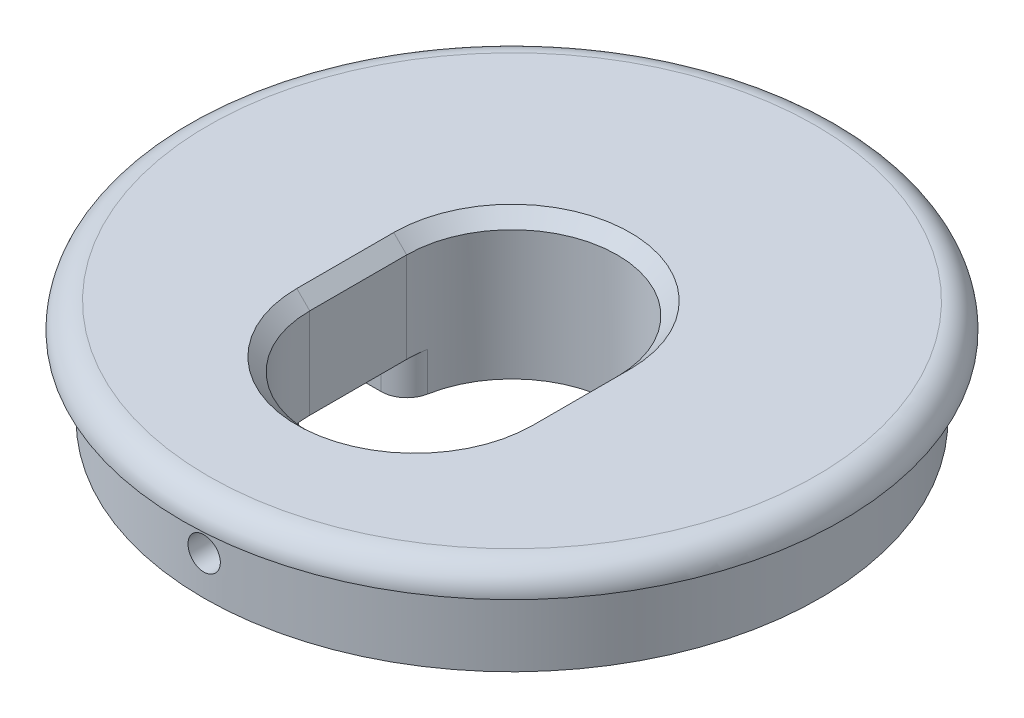
ISO-10303-21;
HEADER;
FILE_DESCRIPTION(('STEP AP214'),'2;1');
FILE_NAME('part.step','',(''),(''),'','','');
FILE_SCHEMA(('AUTOMOTIVE_DESIGN { 1 0 10303 214 1 1 1 1 }'));
ENDSEC;
DATA;
#1=APPLICATION_CONTEXT('core data for automotive mechanical design processes');
#2=APPLICATION_PROTOCOL_DEFINITION('international standard','automotive_design',2000,#1);
#3=PRODUCT_CONTEXT('',#1,'mechanical');
#4=PRODUCT('Part','Part','',(#3));
#5=PRODUCT_RELATED_PRODUCT_CATEGORY('part','',(#4));
#6=PRODUCT_DEFINITION_FORMATION('','',#4);
#7=PRODUCT_DEFINITION_CONTEXT('part definition',#1,'design');
#8=PRODUCT_DEFINITION('design','',#6,#7);
#9=PRODUCT_DEFINITION_SHAPE('','',#8);
#10=(LENGTH_UNIT() NAMED_UNIT(*) SI_UNIT(.MILLI.,.METRE.));
#11=(NAMED_UNIT(*) PLANE_ANGLE_UNIT() SI_UNIT($,.RADIAN.));
#12=(NAMED_UNIT(*) SI_UNIT($,.STERADIAN.) SOLID_ANGLE_UNIT());
#13=UNCERTAINTY_MEASURE_WITH_UNIT(LENGTH_MEASURE(1.E-05),#10,'distance_accuracy_value','');
#14=(GEOMETRIC_REPRESENTATION_CONTEXT(3) GLOBAL_UNCERTAINTY_ASSIGNED_CONTEXT((#13)) GLOBAL_UNIT_ASSIGNED_CONTEXT((#10,
#11,#12)) REPRESENTATION_CONTEXT('',''));
#15=CARTESIAN_POINT('',(0.,0.,0.));
#16=DIRECTION('',(0.,0.,1.));
#17=DIRECTION('',(1.,0.,0.));
#18=AXIS2_PLACEMENT_3D('',#15,#16,#17);
#19=CARTESIAN_POINT('',(0.,6.,0.));
#20=DIRECTION('',(0.,-1.,0.));
#21=DIRECTION('',(0.,0.,-1.));
#22=AXIS2_PLACEMENT_3D('',#19,#20,#21);
#23=CYLINDRICAL_SURFACE('',#22,23.85);
#24=CARTESIAN_POINT('',(0.,6.,0.));
#25=DIRECTION('',(0.,1.,0.));
#26=DIRECTION('',(0.,0.,1.));
#27=AXIS2_PLACEMENT_3D('',#24,#25,#26);
#28=CIRCLE('',#27,23.85);
#29=CARTESIAN_POINT('',(0.,6.,23.85));
#30=VERTEX_POINT('',#29);
#31=EDGE_CURVE('E272',#30,#30,#28,.T.);
#32=ORIENTED_EDGE('',*,*,#31,.F.);
#33=EDGE_LOOP('',(#32));
#34=FACE_BOUND('',#33,.T.);
#35=CARTESIAN_POINT('',(0.,0.,0.));
#36=DIRECTION('',(0.,1.,0.));
#37=DIRECTION('',(0.,0.,1.));
#38=AXIS2_PLACEMENT_3D('',#35,#36,#37);
#39=CIRCLE('',#38,23.85);
#40=CARTESIAN_POINT('',(0.,0.,23.85));
#41=VERTEX_POINT('',#40);
#42=EDGE_CURVE('E271',#41,#41,#39,.T.);
#43=ORIENTED_EDGE('',*,*,#42,.T.);
#44=EDGE_LOOP('',(#43));
#45=FACE_BOUND('',#44,.T.);
#46=CARTESIAN_POINT('',(-1.25,3.,23.81722066069));
#47=CARTESIAN_POINT('',(-1.24999690508999,2.92983870463744,23.817221100708));
#48=CARTESIAN_POINT('',(-1.2440730291785,2.8596277632456,23.8175340172737));
#49=CARTESIAN_POINT('',(-1.22052570717475,2.72114307752026,23.8187520796005));
#50=CARTESIAN_POINT('',(-1.20288850541648,2.65287170935963,23.8196579216518));
#51=CARTESIAN_POINT('',(-1.15642118477801,2.52029227953992,23.8219589462592));
#52=CARTESIAN_POINT('',(-1.12759680728196,2.45598220448565,23.8233538777735));
#53=CARTESIAN_POINT('',(-1.05958225227234,2.33313061608109,23.8264755843004));
#54=CARTESIAN_POINT('',(-1.02039450869785,2.27458775266934,23.8282022813684));
#55=CARTESIAN_POINT('',(-0.932717851737419,2.16485077415866,23.8317951178997));
#56=CARTESIAN_POINT('',(-0.8842200171557,2.11366379060827,23.8336613900523));
#57=CARTESIAN_POINT('',(-0.779317813028455,2.02015243292109,23.8373218376071));
#58=CARTESIAN_POINT('',(-0.722913119677915,1.9778284219216,23.8391160100528));
#59=CARTESIAN_POINT('',(-0.603760436490642,1.90322436854187,23.8424311258197));
#60=CARTESIAN_POINT('',(-0.541008924377159,1.87094994432372,23.8439519161082));
#61=CARTESIAN_POINT('',(-0.410968669936125,1.81739725736795,23.8465475430185));
#62=CARTESIAN_POINT('',(-0.343679964446449,1.7961189053644,23.8476223832606));
#63=CARTESIAN_POINT('',(-0.206541583913002,1.76518138946771,23.8492040966684));
#64=CARTESIAN_POINT('',(-0.136694342894724,1.7555114634578,23.8497114958761));
#65=CARTESIAN_POINT('',(0.00363367426519885,1.74803207618384,23.8501029152775));
#66=CARTESIAN_POINT('',(0.0741144450374732,1.75022251449382,23.8499869407496));
#67=CARTESIAN_POINT('',(0.213635954455751,1.76639275650721,23.8491451237791));
#68=CARTESIAN_POINT('',(0.282678039598408,1.78036097775744,23.8484198805034));
#69=CARTESIAN_POINT('',(0.417436117885965,1.81967232112139,23.8464418990123));
#70=CARTESIAN_POINT('',(0.483152096072797,1.84501549438515,23.8451891584249));
#71=CARTESIAN_POINT('',(0.609429800432564,1.90637053237142,23.8422962523728));
#72=CARTESIAN_POINT('',(0.669988960387398,1.94238766936043,23.8406558955313));
#73=CARTESIAN_POINT('',(0.784205931880767,2.02406439284649,23.8371724654355));
#74=CARTESIAN_POINT('',(0.837863689595656,2.06972405453772,23.8353293906004));
#75=CARTESIAN_POINT('',(0.936822269917707,2.16945518453557,23.8316454427462));
#76=CARTESIAN_POINT('',(0.982112965309352,2.22353670241817,23.8298045750402));
#77=CARTESIAN_POINT('',(1.06297375670352,2.33854108151914,23.8263348017951));
#78=CARTESIAN_POINT('',(1.0985438499262,2.39946394469396,23.8247058963166));
#79=CARTESIAN_POINT('',(1.15895287696253,2.52642780746079,23.821843910867));
#80=CARTESIAN_POINT('',(1.18379142193453,2.59246899240533,23.8206108452389));
#81=CARTESIAN_POINT('',(1.22202547327628,2.72779203804844,23.8186801347279));
#82=CARTESIAN_POINT('',(1.23542107421124,2.7970738719611,23.8179824854202));
#83=CARTESIAN_POINT('',(1.25037644404255,2.93682331863622,23.8172021021869));
#84=CARTESIAN_POINT('',(1.25195027280587,3.00728942287591,23.8171186378013));
#85=CARTESIAN_POINT('',(1.24325412175116,3.14748470087701,23.8175741295224));
#86=CARTESIAN_POINT('',(1.23298418503702,3.21721387731945,23.8181130833637));
#87=CARTESIAN_POINT('',(1.20090369309818,3.3539164039011,23.8197520010396));
#88=CARTESIAN_POINT('',(1.17909958027516,3.42089126997334,23.8208516516852));
#89=CARTESIAN_POINT('',(1.12457619576274,3.55023071973609,23.8234877594683));
#90=CARTESIAN_POINT('',(1.09185685459183,3.6125952740763,23.8250242193864));
#91=CARTESIAN_POINT('',(1.01639573791939,3.73100846608244,23.8283625542441));
#92=CARTESIAN_POINT('',(0.973644522165262,3.78705108063059,23.8301646785832));
#93=CARTESIAN_POINT('',(0.879346989070652,3.89116894644825,23.8338303539688));
#94=CARTESIAN_POINT('',(0.827800610265854,3.93924414203345,23.8356939054444));
#95=CARTESIAN_POINT('',(0.717315553601281,4.0261097814887,23.8392745374574));
#96=CARTESIAN_POINT('',(0.658369727870015,4.06489114068172,23.8409914736327));
#97=CARTESIAN_POINT('',(0.534795129540166,4.13200613116371,23.844083315286));
#98=CARTESIAN_POINT('',(0.470166383500559,4.1603398112764,23.8454582223624));
#99=CARTESIAN_POINT('',(0.337094242668914,4.20573928350928,23.8477103690238));
#100=CARTESIAN_POINT('',(0.268652831426054,4.2228108764742,23.8485878647811));
#101=CARTESIAN_POINT('',(0.12987042268335,4.24522056901735,23.8497473180758));
#102=CARTESIAN_POINT('',(0.0595294373027974,4.25055874343694,23.8500292794117));
#103=CARTESIAN_POINT('',(-0.0809652767491145,4.24934935722586,23.849965904145));
#104=CARTESIAN_POINT('',(-0.151119128820238,4.24281604071006,23.8496213193092));
#105=CARTESIAN_POINT('',(-0.289332473312419,4.2180785905529,23.8483451193808));
#106=CARTESIAN_POINT('',(-0.357391961828585,4.19987443515292,23.8474135031938));
#107=CARTESIAN_POINT('',(-0.489487429071414,4.15231503367602,23.8450680352763));
#108=CARTESIAN_POINT('',(-0.553523386755903,4.12295972928672,23.8436541810239));
#109=CARTESIAN_POINT('',(-0.675758971237734,4.0539336728648,23.8405031973614));
#110=CARTESIAN_POINT('',(-0.733958772227299,4.01426322883601,23.8387660776041));
#111=CARTESIAN_POINT('',(-0.842941383495588,3.925681591317,23.8351616598384));
#112=CARTESIAN_POINT('',(-0.893716046056473,3.8767603797616,23.8332942220991));
#113=CARTESIAN_POINT('',(-0.986348131856232,3.77107416498042,23.829640629739));
#114=CARTESIAN_POINT('',(-1.02820336013134,3.71430723667256,23.8278544952106));
#115=CARTESIAN_POINT('',(-1.10183007918546,3.59449280792074,23.8245636759377));
#116=CARTESIAN_POINT('',(-1.133591355891,3.53143903001002,23.8230592769095));
#117=CARTESIAN_POINT('',(-1.18603847821835,3.40093291948966,23.8205060541796));
#118=CARTESIAN_POINT('',(-1.2067373866154,3.33348588067621,23.8194566934327));
#119=CARTESIAN_POINT('',(-1.23105149530587,3.22135074868723,23.8182093141891));
#120=CARTESIAN_POINT('',(-1.23814809222798,3.17738872786796,23.8178402079887));
#121=CARTESIAN_POINT('',(-1.24762332357121,3.0889577915305,23.8173457418482));
#122=CARTESIAN_POINT('',(-1.25000196246476,3.04448887649285,23.8172203816771));
#123=CARTESIAN_POINT('',(-1.25,3.,23.81722066069));
#124=B_SPLINE_CURVE_WITH_KNOTS('',3,(#46,#47,#48,#49,#50,#51,#52,#53,#54,#55,#56,#57,#58,#59,
#60,#61,#62,#63,#64,#65,#66,#67,#68,#69,#70,#71,#72,#73,#74,#75,#76,#77,#78,#79,#80,#81,#82,#83,
#84,#85,#86,#87,#88,#89,#90,#91,#92,#93,#94,#95,#96,#97,#98,#99,#100,#101,#102,#103,#104,#105,
#106,#107,#108,#109,#110,#111,#112,#113,#114,#115,#116,#117,#118,#119,#120,#121,#122,#123),
.UNSPECIFIED.,.T.,.F.,(4,2,2,2,2,2,2,2,2,2,2,2,2,2,2,2,2,2,2,2,2,2,2,2,2,2,2,2,2,2,2,2,2,2,2,2,
2,2,4),(0.,0.210321482712148,0.42089039643201,0.631351386416259,0.841762991384033,
1.05237723437591,1.26300010505214,1.47374051267052,1.68447920947488,1.89502238017331,
2.1055637681295,2.31589834760055,2.52623387289789,2.73667346436094,2.94711469693097,
3.15780899529022,3.36850335390266,3.57920534607079,3.78990559696746,4.00035521816041,
4.21080407345067,4.42113550668034,4.63146827881242,4.84199977891122,5.05253275035346,
5.26327068485301,5.47400763452682,5.68463595346834,5.89526292891757,6.10563734856057,
6.31601216041801,6.52638807239748,6.73675770340066,6.9473564713996,7.15800700548613,
7.36887002319704,7.5794834943083,7.71284727115769,7.84621092158378),.UNSPECIFIED.);
#125=CARTESIAN_POINT('',(-1.25,3.,23.81722066069));
#126=VERTEX_POINT('',#125);
#127=EDGE_CURVE('E40',#126,#126,#124,.T.);
#128=ORIENTED_EDGE('',*,*,#127,.F.);
#129=EDGE_LOOP('',(#128));
#130=FACE_BOUND('',#129,.T.);
#131=ADVANCED_FACE('F35',(#34,#45,#130),#23,.T.);
#132=CARTESIAN_POINT('',(0.,-3.,7.5));
#133=DIRECTION('',(0.,-1.,0.));
#134=DIRECTION('',(0.,0.,-1.));
#135=AXIS2_PLACEMENT_3D('',#132,#133,#134);
#136=PLANE('',#135);
#137=CARTESIAN_POINT('',(0.,-3.,7.5));
#138=DIRECTION('',(0.,-1.,0.));
#139=DIRECTION('',(0.,0.,-1.));
#140=AXIS2_PLACEMENT_3D('',#137,#138,#139);
#141=CIRCLE('',#140,8.15);
#142=CARTESIAN_POINT('',(8.01348144563377,-3.,8.98546798029557));
#143=VERTEX_POINT('',#142);
#144=CARTESIAN_POINT('',(-8.01348144563377,-3.,8.98546798029556));
#145=VERTEX_POINT('',#144);
#146=EDGE_CURVE('E383',#143,#145,#141,.T.);
#147=ORIENTED_EDGE('',*,*,#146,.F.);
#148=CARTESIAN_POINT('',(9.97997995989972,-3.,9.35));
#149=DIRECTION('',(0.,-1.,0.));
#150=DIRECTION('',(0.,0.,-1.));
#151=AXIS2_PLACEMENT_3D('',#148,#149,#150);
#152=CIRCLE('',#151,2.);
#153=CARTESIAN_POINT('',(9.97997995989972,-3.,7.35));
#154=VERTEX_POINT('',#153);
#155=EDGE_CURVE('E317',#143,#154,#152,.T.);
#156=ORIENTED_EDGE('',*,*,#155,.T.);
#157=DIRECTION('',(-1.,0.,0.));
#158=VECTOR('',#157,1.);
#159=CARTESIAN_POINT('',(14.,-3.,7.35));
#160=LINE('',#159,#158);
#161=CARTESIAN_POINT('',(12.15,-3.,7.35));
#162=VERTEX_POINT('',#161);
#163=EDGE_CURVE('E372',#162,#154,#160,.T.);
#164=ORIENTED_EDGE('',*,*,#163,.F.);
#165=DIRECTION('',(0.,0.,1.));
#166=VECTOR('',#165,1.);
#167=CARTESIAN_POINT('',(12.15,-3.,0.));
#168=LINE('',#167,#166);
#169=CARTESIAN_POINT('',(12.15,-3.,7.5));
#170=VERTEX_POINT('',#169);
#171=EDGE_CURVE('E231',#162,#170,#168,.T.);
#172=ORIENTED_EDGE('',*,*,#171,.T.);
#173=CARTESIAN_POINT('',(0.,-3.,7.5));
#174=DIRECTION('',(0.,-1.,0.));
#175=DIRECTION('',(0.,0.,-1.));
#176=AXIS2_PLACEMENT_3D('',#173,#174,#175);
#177=CIRCLE('',#176,12.15);
#178=CARTESIAN_POINT('',(-12.15,-3.,7.5));
#179=VERTEX_POINT('',#178);
#180=EDGE_CURVE('E221',#170,#179,#177,.T.);
#181=ORIENTED_EDGE('',*,*,#180,.T.);
#182=DIRECTION('',(0.,0.,-1.));
#183=VECTOR('',#182,1.);
#184=CARTESIAN_POINT('',(-12.15,-3.,7.5));
#185=LINE('',#184,#183);
#186=CARTESIAN_POINT('',(-12.15,-3.,7.35));
#187=VERTEX_POINT('',#186);
#188=EDGE_CURVE('E220',#179,#187,#185,.T.);
#189=ORIENTED_EDGE('',*,*,#188,.T.);
#190=CARTESIAN_POINT('',(-9.97997995989972,-3.,7.35));
#191=VERTEX_POINT('',#190);
#192=EDGE_CURVE('E213',#191,#187,#160,.T.);
#193=ORIENTED_EDGE('',*,*,#192,.F.);
#194=CARTESIAN_POINT('',(-9.97997995989972,-3.,9.35));
#195=DIRECTION('',(0.,-1.,0.));
#196=DIRECTION('',(0.,0.,-1.));
#197=AXIS2_PLACEMENT_3D('',#194,#195,#196);
#198=CIRCLE('',#197,2.);
#199=EDGE_CURVE('E315',#191,#145,#198,.T.);
#200=ORIENTED_EDGE('',*,*,#199,.T.);
#201=EDGE_LOOP('',(#147,#156,#164,#172,#181,#189,#193,#200));
#202=FACE_BOUND('',#201,.T.);
#203=ADVANCED_FACE('F417',(#202),#136,.T.);
#204=CARTESIAN_POINT('',(-12.15,-3.,7.5));
#205=DIRECTION('',(1.,0.,0.));
#206=DIRECTION('',(0.,0.,-1.));
#207=AXIS2_PLACEMENT_3D('',#204,#205,#206);
#208=PLANE('',#207);
#209=DIRECTION('',(0.,0.,-1.));
#210=VECTOR('',#209,1.);
#211=CARTESIAN_POINT('',(-12.15,0.,7.5));
#212=LINE('',#211,#210);
#213=CARTESIAN_POINT('',(-12.15,0.,7.5));
#214=VERTEX_POINT('',#213);
#215=CARTESIAN_POINT('',(-12.15,0.,7.35));
#216=VERTEX_POINT('',#215);
#217=EDGE_CURVE('E241',#214,#216,#212,.T.);
#218=ORIENTED_EDGE('',*,*,#217,.T.);
#219=DIRECTION('',(0.,-1.,0.));
#220=VECTOR('',#219,1.);
#221=CARTESIAN_POINT('',(-12.15,-3.,7.35));
#222=LINE('',#221,#220);
#223=EDGE_CURVE('E203',#216,#187,#222,.T.);
#224=ORIENTED_EDGE('',*,*,#223,.T.);
#225=ORIENTED_EDGE('',*,*,#188,.F.);
#226=DIRECTION('',(0.,1.,0.));
#227=VECTOR('',#226,1.);
#228=CARTESIAN_POINT('',(-12.15,-3.,7.5));
#229=LINE('',#228,#227);
#230=EDGE_CURVE('E256',#179,#214,#229,.T.);
#231=ORIENTED_EDGE('',*,*,#230,.T.);
#232=EDGE_LOOP('',(#218,#224,#225,#231));
#233=FACE_BOUND('',#232,.T.);
#234=ADVANCED_FACE('F422',(#233),#208,.F.);
#235=CARTESIAN_POINT('',(12.15,-3.,0.));
#236=DIRECTION('',(-1.,0.,0.));
#237=DIRECTION('',(0.,0.,1.));
#238=AXIS2_PLACEMENT_3D('',#235,#236,#237);
#239=PLANE('',#238);
#240=ORIENTED_EDGE('',*,*,#171,.F.);
#241=DIRECTION('',(0.,1.,0.));
#242=VECTOR('',#241,1.);
#243=CARTESIAN_POINT('',(12.15,-3.,7.35));
#244=LINE('',#243,#242);
#245=CARTESIAN_POINT('',(12.15,0.,7.35));
#246=VERTEX_POINT('',#245);
#247=EDGE_CURVE('E283',#162,#246,#244,.T.);
#248=ORIENTED_EDGE('',*,*,#247,.T.);
#249=DIRECTION('',(0.,0.,1.));
#250=VECTOR('',#249,1.);
#251=CARTESIAN_POINT('',(12.15,0.,0.));
#252=LINE('',#251,#250);
#253=CARTESIAN_POINT('',(12.15,0.,7.5));
#254=VERTEX_POINT('',#253);
#255=EDGE_CURVE('E247',#246,#254,#252,.T.);
#256=ORIENTED_EDGE('',*,*,#255,.T.);
#257=DIRECTION('',(0.,1.,0.));
#258=VECTOR('',#257,1.);
#259=CARTESIAN_POINT('',(12.15,-3.,7.5));
#260=LINE('',#259,#258);
#261=EDGE_CURVE('E235',#170,#254,#260,.T.);
#262=ORIENTED_EDGE('',*,*,#261,.F.);
#263=EDGE_LOOP('',(#240,#248,#256,#262));
#264=FACE_BOUND('',#263,.T.);
#265=ADVANCED_FACE('F511',(#264),#239,.F.);
#266=CARTESIAN_POINT('',(0.,0.,0.));
#267=DIRECTION('',(0.,1.,0.));
#268=DIRECTION('',(0.,0.,1.));
#269=AXIS2_PLACEMENT_3D('',#266,#267,#268);
#270=PLANE('',#269);
#271=CARTESIAN_POINT('',(-11.,0.,3.75));
#272=DIRECTION('',(0.,-1.,0.));
#273=DIRECTION('',(0.,0.,-1.));
#274=AXIS2_PLACEMENT_3D('',#271,#272,#273);
#275=CIRCLE('',#274,1.25);
#276=CARTESIAN_POINT('',(-11.,0.,2.5));
#277=VERTEX_POINT('',#276);
#278=EDGE_CURVE('E366',#277,#277,#275,.T.);
#279=ORIENTED_EDGE('',*,*,#278,.F.);
#280=EDGE_LOOP('',(#279));
#281=FACE_BOUND('',#280,.T.);
#282=CARTESIAN_POINT('',(11.,0.,3.75));
#283=DIRECTION('',(0.,-1.,0.));
#284=DIRECTION('',(0.,0.,-1.));
#285=AXIS2_PLACEMENT_3D('',#282,#283,#284);
#286=CIRCLE('',#285,1.25);
#287=CARTESIAN_POINT('',(11.,0.,2.5));
#288=VERTEX_POINT('',#287);
#289=EDGE_CURVE('E355',#288,#288,#286,.T.);
#290=ORIENTED_EDGE('',*,*,#289,.F.);
#291=EDGE_LOOP('',(#290));
#292=FACE_BOUND('',#291,.T.);
#293=DIRECTION('',(0.,0.,1.));
#294=VECTOR('',#293,1.);
#295=CARTESIAN_POINT('',(-8.15,0.,0.));
#296=LINE('',#295,#294);
#297=CARTESIAN_POINT('',(-8.15,0.,0.));
#298=VERTEX_POINT('',#297);
#299=CARTESIAN_POINT('',(-8.15,0.,7.5));
#300=VERTEX_POINT('',#299);
#301=EDGE_CURVE('E378',#298,#300,#296,.T.);
#302=ORIENTED_EDGE('',*,*,#301,.T.);
#303=CARTESIAN_POINT('',(0.,0.,7.5));
#304=DIRECTION('',(0.,1.,0.));
#305=DIRECTION('',(0.,0.,1.));
#306=AXIS2_PLACEMENT_3D('',#303,#304,#305);
#307=CIRCLE('',#306,8.15);
#308=CARTESIAN_POINT('',(-8.01348144563377,0.,8.98546798029556));
#309=VERTEX_POINT('',#308);
#310=EDGE_CURVE('E303',#309,#300,#307,.F.);
#311=ORIENTED_EDGE('',*,*,#310,.F.);
#312=CARTESIAN_POINT('',(-9.97997995989972,0.,9.35));
#313=DIRECTION('',(0.,1.,0.));
#314=DIRECTION('',(0.,0.,1.));
#315=AXIS2_PLACEMENT_3D('',#312,#313,#314);
#316=CIRCLE('',#315,2.);
#317=CARTESIAN_POINT('',(-9.97997995989972,0.,7.35));
#318=VERTEX_POINT('',#317);
#319=EDGE_CURVE('E331',#309,#318,#316,.T.);
#320=ORIENTED_EDGE('',*,*,#319,.T.);
#321=DIRECTION('',(-1.,0.,0.));
#322=VECTOR('',#321,1.);
#323=CARTESIAN_POINT('',(14.,0.,7.35));
#324=LINE('',#323,#322);
#325=EDGE_CURVE('E373',#318,#216,#324,.T.);
#326=ORIENTED_EDGE('',*,*,#325,.T.);
#327=ORIENTED_EDGE('',*,*,#217,.F.);
#328=CARTESIAN_POINT('',(0.,0.,7.5));
#329=DIRECTION('',(0.,-1.,0.));
#330=DIRECTION('',(0.,0.,-1.));
#331=AXIS2_PLACEMENT_3D('',#328,#329,#330);
#332=CIRCLE('',#331,12.15);
#333=EDGE_CURVE('E236',#254,#214,#332,.T.);
#334=ORIENTED_EDGE('',*,*,#333,.F.);
#335=ORIENTED_EDGE('',*,*,#255,.F.);
#336=CARTESIAN_POINT('',(9.97997995989972,0.,7.35));
#337=VERTEX_POINT('',#336);
#338=EDGE_CURVE('E374',#246,#337,#324,.T.);
#339=ORIENTED_EDGE('',*,*,#338,.T.);
#340=CARTESIAN_POINT('',(9.97997995989972,0.,9.35));
#341=DIRECTION('',(0.,1.,0.));
#342=DIRECTION('',(0.,0.,1.));
#343=AXIS2_PLACEMENT_3D('',#340,#341,#342);
#344=CIRCLE('',#343,2.);
#345=CARTESIAN_POINT('',(8.01348144563377,0.,8.98546798029557));
#346=VERTEX_POINT('',#345);
#347=EDGE_CURVE('E327',#337,#346,#344,.T.);
#348=ORIENTED_EDGE('',*,*,#347,.T.);
#349=CARTESIAN_POINT('',(0.,0.,7.5));
#350=DIRECTION('',(0.,1.,0.));
#351=DIRECTION('',(0.,0.,1.));
#352=AXIS2_PLACEMENT_3D('',#349,#350,#351);
#353=CIRCLE('',#352,8.15);
#354=CARTESIAN_POINT('',(8.15,0.,7.5));
#355=VERTEX_POINT('',#354);
#356=EDGE_CURVE('E309',#355,#346,#353,.F.);
#357=ORIENTED_EDGE('',*,*,#356,.F.);
#358=DIRECTION('',(0.,0.,-1.));
#359=VECTOR('',#358,1.);
#360=CARTESIAN_POINT('',(8.15,0.,0.));
#361=LINE('',#360,#359);
#362=CARTESIAN_POINT('',(8.15,0.,0.));
#363=VERTEX_POINT('',#362);
#364=EDGE_CURVE('E204',#355,#363,#361,.T.);
#365=ORIENTED_EDGE('',*,*,#364,.T.);
#366=CARTESIAN_POINT('',(0.,0.,0.));
#367=DIRECTION('',(0.,1.,0.));
#368=DIRECTION('',(0.,0.,1.));
#369=AXIS2_PLACEMENT_3D('',#366,#367,#368);
#370=CIRCLE('',#369,8.15);
#371=CARTESIAN_POINT('',(8.01348144563377,0.,-1.48546798029557));
#372=VERTEX_POINT('',#371);
#373=EDGE_CURVE('E292',#372,#363,#370,.F.);
#374=ORIENTED_EDGE('',*,*,#373,.F.);
#375=CARTESIAN_POINT('',(9.97997995989972,0.,-1.85));
#376=DIRECTION('',(0.,1.,0.));
#377=DIRECTION('',(0.,0.,1.));
#378=AXIS2_PLACEMENT_3D('',#375,#376,#377);
#379=CIRCLE('',#378,2.);
#380=CARTESIAN_POINT('',(9.97997995989972,0.,0.149999999999998));
#381=VERTEX_POINT('',#380);
#382=EDGE_CURVE('E325',#372,#381,#379,.T.);
#383=ORIENTED_EDGE('',*,*,#382,.T.);
#384=DIRECTION('',(1.,0.,0.));
#385=VECTOR('',#384,1.);
#386=CARTESIAN_POINT('',(14.,0.,0.149999999999999));
#387=LINE('',#386,#385);
#388=CARTESIAN_POINT('',(12.15,0.,0.149999999999995));
#389=VERTEX_POINT('',#388);
#390=EDGE_CURVE('E370',#381,#389,#387,.T.);
#391=ORIENTED_EDGE('',*,*,#390,.T.);
#392=CARTESIAN_POINT('',(12.15,0.,0.));
#393=VERTEX_POINT('',#392);
#394=EDGE_CURVE('E226',#393,#389,#252,.T.);
#395=ORIENTED_EDGE('',*,*,#394,.F.);
#396=CARTESIAN_POINT('',(0.,0.,0.));
#397=DIRECTION('',(0.,-1.,0.));
#398=DIRECTION('',(0.,0.,-1.));
#399=AXIS2_PLACEMENT_3D('',#396,#397,#398);
#400=CIRCLE('',#399,12.15);
#401=CARTESIAN_POINT('',(-12.15,0.,0.));
#402=VERTEX_POINT('',#401);
#403=EDGE_CURVE('E244',#402,#393,#400,.T.);
#404=ORIENTED_EDGE('',*,*,#403,.F.);
#405=CARTESIAN_POINT('',(-12.15,0.,0.149999999999995));
#406=VERTEX_POINT('',#405);
#407=EDGE_CURVE('E239',#406,#402,#212,.T.);
#408=ORIENTED_EDGE('',*,*,#407,.F.);
#409=CARTESIAN_POINT('',(-9.97997995989972,0.,0.149999999999996));
#410=VERTEX_POINT('',#409);
#411=EDGE_CURVE('E199',#406,#410,#387,.T.);
#412=ORIENTED_EDGE('',*,*,#411,.T.);
#413=CARTESIAN_POINT('',(-9.97997995989972,0.,-1.85));
#414=DIRECTION('',(0.,1.,0.));
#415=DIRECTION('',(0.,0.,1.));
#416=AXIS2_PLACEMENT_3D('',#413,#414,#415);
#417=CIRCLE('',#416,2.);
#418=CARTESIAN_POINT('',(-8.01348144563377,0.,-1.48546798029557));
#419=VERTEX_POINT('',#418);
#420=EDGE_CURVE('E329',#410,#419,#417,.T.);
#421=ORIENTED_EDGE('',*,*,#420,.T.);
#422=CARTESIAN_POINT('',(0.,0.,0.));
#423=DIRECTION('',(0.,1.,0.));
#424=DIRECTION('',(0.,0.,1.));
#425=AXIS2_PLACEMENT_3D('',#422,#423,#424);
#426=CIRCLE('',#425,8.15);
#427=EDGE_CURVE('E286',#298,#419,#426,.F.);
#428=ORIENTED_EDGE('',*,*,#427,.F.);
#429=EDGE_LOOP('',(#302,#311,#320,#326,#327,#334,#335,#339,#348,#357,#365,#374,#383,#391,#395,
#404,#408,#412,#421,#428));
#430=FACE_BOUND('',#429,.T.);
#431=ORIENTED_EDGE('',*,*,#42,.F.);
#432=EDGE_LOOP('',(#431));
#433=FACE_BOUND('',#432,.T.);
#434=ADVANCED_FACE('F397',(#281,#292,#430,#433),#270,.F.);
#435=CARTESIAN_POINT('',(0.,8.,0.));
#436=DIRECTION('',(0.,1.,0.));
#437=DIRECTION('',(0.,0.,1.));
#438=AXIS2_PLACEMENT_3D('',#435,#436,#437);
#439=PLANE('',#438);
#440=CARTESIAN_POINT('',(0.,8.,7.5));
#441=DIRECTION('',(0.,1.,0.));
#442=DIRECTION('',(0.,0.,1.));
#443=AXIS2_PLACEMENT_3D('',#440,#441,#442);
#444=CIRCLE('',#443,9.15000000000001);
#445=CARTESIAN_POINT('',(9.15000000000002,8.,7.5));
#446=VERTEX_POINT('',#445);
#447=CARTESIAN_POINT('',(-9.15000000000001,8.,7.5));
#448=VERTEX_POINT('',#447);
#449=EDGE_CURVE('E340',#446,#448,#444,.F.);
#450=ORIENTED_EDGE('',*,*,#449,.T.);
#451=DIRECTION('',(0.,0.,-1.));
#452=VECTOR('',#451,1.);
#453=CARTESIAN_POINT('',(-9.15000000000001,8.,0.));
#454=LINE('',#453,#452);
#455=CARTESIAN_POINT('',(-9.15000000000001,8.,0.));
#456=VERTEX_POINT('',#455);
#457=EDGE_CURVE('E342',#448,#456,#454,.T.);
#458=ORIENTED_EDGE('',*,*,#457,.T.);
#459=CARTESIAN_POINT('',(0.,8.,0.));
#460=DIRECTION('',(0.,1.,0.));
#461=DIRECTION('',(0.,0.,1.));
#462=AXIS2_PLACEMENT_3D('',#459,#460,#461);
#463=CIRCLE('',#462,9.15000000000001);
#464=CARTESIAN_POINT('',(9.15000000000001,8.,0.));
#465=VERTEX_POINT('',#464);
#466=EDGE_CURVE('E336',#456,#465,#463,.F.);
#467=ORIENTED_EDGE('',*,*,#466,.T.);
#468=DIRECTION('',(0.,0.,1.));
#469=VECTOR('',#468,1.);
#470=CARTESIAN_POINT('',(9.15000000000002,8.,7.5));
#471=LINE('',#470,#469);
#472=EDGE_CURVE('E338',#465,#446,#471,.T.);
#473=ORIENTED_EDGE('',*,*,#472,.T.);
#474=EDGE_LOOP('',(#450,#458,#467,#473));
#475=FACE_BOUND('',#474,.T.);
#476=CARTESIAN_POINT('',(0.,8.,0.));
#477=DIRECTION('',(0.,1.,0.));
#478=DIRECTION('',(0.,0.,1.));
#479=AXIS2_PLACEMENT_3D('',#476,#477,#478);
#480=CIRCLE('',#479,23.5);
#481=CARTESIAN_POINT('',(0.,8.,23.5));
#482=VERTEX_POINT('',#481);
#483=EDGE_CURVE('E275',#482,#482,#480,.T.);
#484=ORIENTED_EDGE('',*,*,#483,.T.);
#485=EDGE_LOOP('',(#484));
#486=FACE_BOUND('',#485,.T.);
#487=ADVANCED_FACE('F482',(#475,#486),#439,.T.);
#488=CARTESIAN_POINT('',(0.,6.,0.));
#489=DIRECTION('',(0.,1.,0.));
#490=DIRECTION('',(0.,0.,1.));
#491=AXIS2_PLACEMENT_3D('',#488,#489,#490);
#492=PLANE('',#491);
#493=ORIENTED_EDGE('',*,*,#31,.T.);
#494=EDGE_LOOP('',(#493));
#495=FACE_BOUND('',#494,.T.);
#496=CARTESIAN_POINT('',(0.,6.,0.));
#497=DIRECTION('',(0.,1.,0.));
#498=DIRECTION('',(0.,0.,1.));
#499=AXIS2_PLACEMENT_3D('',#496,#497,#498);
#500=CIRCLE('',#499,25.5);
#501=CARTESIAN_POINT('',(0.,6.,25.5));
#502=VERTEX_POINT('',#501);
#503=EDGE_CURVE('E262',#502,#502,#500,.T.);
#504=ORIENTED_EDGE('',*,*,#503,.F.);
#505=EDGE_LOOP('',(#504));
#506=FACE_BOUND('',#505,.T.);
#507=ADVANCED_FACE('F434',(#495,#506),#492,.F.);
#508=CARTESIAN_POINT('',(0.,6.,0.));
#509=DIRECTION('',(0.,1.,0.));
#510=DIRECTION('',(0.,0.,1.));
#511=AXIS2_PLACEMENT_3D('',#508,#509,#510);
#512=TOROIDAL_SURFACE('',#511,23.5,2.);
#513=ORIENTED_EDGE('',*,*,#503,.T.);
#514=EDGE_LOOP('',(#513));
#515=FACE_BOUND('',#514,.T.);
#516=ORIENTED_EDGE('',*,*,#483,.F.);
#517=EDGE_LOOP('',(#516));
#518=FACE_BOUND('',#517,.T.);
#519=ADVANCED_FACE('F431',(#515,#518),#512,.T.);
#520=CARTESIAN_POINT('',(0.,0.,0.));
#521=DIRECTION('',(0.,1.,0.));
#522=DIRECTION('',(0.,0.,1.));
#523=AXIS2_PLACEMENT_3D('',#520,#521,#522);
#524=CYLINDRICAL_SURFACE('',#523,8.15);
#525=DIRECTION('',(0.,1.,0.));
#526=VECTOR('',#525,1.);
#527=CARTESIAN_POINT('',(8.15,0.,0.));
#528=LINE('',#527,#526);
#529=CARTESIAN_POINT('',(8.15,7.,0.));
#530=VERTEX_POINT('',#529);
#531=EDGE_CURVE('E260',#363,#530,#528,.T.);
#532=ORIENTED_EDGE('',*,*,#531,.T.);
#533=CARTESIAN_POINT('',(0.,7.,0.));
#534=DIRECTION('',(0.,1.,0.));
#535=DIRECTION('',(0.,0.,1.));
#536=AXIS2_PLACEMENT_3D('',#533,#534,#535);
#537=CIRCLE('',#536,8.15);
#538=CARTESIAN_POINT('',(-8.15,7.,0.));
#539=VERTEX_POINT('',#538);
#540=EDGE_CURVE('E11',#530,#539,#537,.T.);
#541=ORIENTED_EDGE('',*,*,#540,.T.);
#542=DIRECTION('',(0.,1.,0.));
#543=VECTOR('',#542,1.);
#544=CARTESIAN_POINT('',(-8.15,0.,0.));
#545=LINE('',#544,#543);
#546=EDGE_CURVE('E259',#298,#539,#545,.T.);
#547=ORIENTED_EDGE('',*,*,#546,.F.);
#548=ORIENTED_EDGE('',*,*,#427,.T.);
#549=DIRECTION('',(0.,1.,0.));
#550=VECTOR('',#549,1.);
#551=CARTESIAN_POINT('',(-8.01348144563377,0.,-1.48546798029557));
#552=LINE('',#551,#550);
#553=CARTESIAN_POINT('',(-8.01348144563377,-3.,-1.48546798029557));
#554=VERTEX_POINT('',#553);
#555=EDGE_CURVE('E289',#419,#554,#552,.F.);
#556=ORIENTED_EDGE('',*,*,#555,.T.);
#557=CARTESIAN_POINT('',(0.,-3.,0.));
#558=DIRECTION('',(0.,-1.,0.));
#559=DIRECTION('',(0.,0.,-1.));
#560=AXIS2_PLACEMENT_3D('',#557,#558,#559);
#561=CIRCLE('',#560,8.15);
#562=CARTESIAN_POINT('',(8.01348144563377,-3.,-1.48546798029557));
#563=VERTEX_POINT('',#562);
#564=EDGE_CURVE('E240',#554,#563,#561,.T.);
#565=ORIENTED_EDGE('',*,*,#564,.T.);
#566=DIRECTION('',(0.,1.,0.));
#567=VECTOR('',#566,1.);
#568=CARTESIAN_POINT('',(8.01348144563377,0.,-1.48546798029557));
#569=LINE('',#568,#567);
#570=EDGE_CURVE('E295',#563,#372,#569,.T.);
#571=ORIENTED_EDGE('',*,*,#570,.T.);
#572=ORIENTED_EDGE('',*,*,#373,.T.);
#573=EDGE_LOOP('',(#532,#541,#547,#548,#556,#565,#571,#572));
#574=FACE_BOUND('',#573,.T.);
#575=ADVANCED_FACE('F388',(#574),#524,.F.);
#576=CARTESIAN_POINT('',(8.15,0.,0.));
#577=DIRECTION('',(1.,0.,0.));
#578=DIRECTION('',(0.,0.,-1.));
#579=AXIS2_PLACEMENT_3D('',#576,#577,#578);
#580=PLANE('',#579);
#581=DIRECTION('',(0.,1.,0.));
#582=VECTOR('',#581,1.);
#583=CARTESIAN_POINT('',(8.15,0.,7.5));
#584=LINE('',#583,#582);
#585=CARTESIAN_POINT('',(8.15,7.,7.5));
#586=VERTEX_POINT('',#585);
#587=EDGE_CURVE('E263',#355,#586,#584,.T.);
#588=ORIENTED_EDGE('',*,*,#587,.T.);
#589=DIRECTION('',(0.,0.,-1.));
#590=VECTOR('',#589,1.);
#591=CARTESIAN_POINT('',(8.15,7.,0.));
#592=LINE('',#591,#590);
#593=EDGE_CURVE('E50',#586,#530,#592,.T.);
#594=ORIENTED_EDGE('',*,*,#593,.T.);
#595=ORIENTED_EDGE('',*,*,#531,.F.);
#596=ORIENTED_EDGE('',*,*,#364,.F.);
#597=EDGE_LOOP('',(#588,#594,#595,#596));
#598=FACE_BOUND('',#597,.T.);
#599=ADVANCED_FACE('F400',(#598),#580,.F.);
#600=CARTESIAN_POINT('',(0.,0.,7.5));
#601=DIRECTION('',(0.,1.,0.));
#602=DIRECTION('',(0.,0.,1.));
#603=AXIS2_PLACEMENT_3D('',#600,#601,#602);
#604=CYLINDRICAL_SURFACE('',#603,8.15);
#605=DIRECTION('',(0.,1.,0.));
#606=VECTOR('',#605,1.);
#607=CARTESIAN_POINT('',(-8.15,0.,7.5));
#608=LINE('',#607,#606);
#609=CARTESIAN_POINT('',(-8.15,7.,7.5));
#610=VERTEX_POINT('',#609);
#611=EDGE_CURVE('E265',#300,#610,#608,.T.);
#612=ORIENTED_EDGE('',*,*,#611,.T.);
#613=CARTESIAN_POINT('',(0.,7.,7.5));
#614=DIRECTION('',(0.,1.,0.));
#615=DIRECTION('',(0.,0.,1.));
#616=AXIS2_PLACEMENT_3D('',#613,#614,#615);
#617=CIRCLE('',#616,8.15);
#618=EDGE_CURVE('E65',#610,#586,#617,.T.);
#619=ORIENTED_EDGE('',*,*,#618,.T.);
#620=ORIENTED_EDGE('',*,*,#587,.F.);
#621=ORIENTED_EDGE('',*,*,#356,.T.);
#622=DIRECTION('',(0.,1.,0.));
#623=VECTOR('',#622,1.);
#624=CARTESIAN_POINT('',(8.01348144563377,0.,8.98546798029557));
#625=LINE('',#624,#623);
#626=EDGE_CURVE('E312',#346,#143,#625,.F.);
#627=ORIENTED_EDGE('',*,*,#626,.T.);
#628=ORIENTED_EDGE('',*,*,#146,.T.);
#629=DIRECTION('',(0.,1.,0.));
#630=VECTOR('',#629,1.);
#631=CARTESIAN_POINT('',(-8.01348144563377,0.,8.98546798029556));
#632=LINE('',#631,#630);
#633=EDGE_CURVE('E306',#145,#309,#632,.T.);
#634=ORIENTED_EDGE('',*,*,#633,.T.);
#635=ORIENTED_EDGE('',*,*,#310,.T.);
#636=EDGE_LOOP('',(#612,#619,#620,#621,#627,#628,#634,#635));
#637=FACE_BOUND('',#636,.T.);
#638=ADVANCED_FACE('F404',(#637),#604,.F.);
#639=CARTESIAN_POINT('',(-8.15,0.,0.));
#640=DIRECTION('',(-1.,0.,0.));
#641=DIRECTION('',(0.,0.,1.));
#642=AXIS2_PLACEMENT_3D('',#639,#640,#641);
#643=PLANE('',#642);
#644=ORIENTED_EDGE('',*,*,#546,.T.);
#645=DIRECTION('',(0.,0.,1.));
#646=VECTOR('',#645,1.);
#647=CARTESIAN_POINT('',(-8.15,7.,7.5));
#648=LINE('',#647,#646);
#649=EDGE_CURVE('E333',#539,#610,#648,.T.);
#650=ORIENTED_EDGE('',*,*,#649,.T.);
#651=ORIENTED_EDGE('',*,*,#611,.F.);
#652=ORIENTED_EDGE('',*,*,#301,.F.);
#653=EDGE_LOOP('',(#644,#650,#651,#652));
#654=FACE_BOUND('',#653,.T.);
#655=ADVANCED_FACE('F407',(#654),#643,.F.);
#656=DIRECTION('',(1.,0.,0.));
#657=VECTOR('',#656,1.);
#658=CARTESIAN_POINT('',(14.,-3.,0.149999999999999));
#659=LINE('',#658,#657);
#660=CARTESIAN_POINT('',(9.97997995989972,-3.,0.149999999999998));
#661=VERTEX_POINT('',#660);
#662=CARTESIAN_POINT('',(12.15,-3.,0.149999999999998));
#663=VERTEX_POINT('',#662);
#664=EDGE_CURVE('E214',#661,#663,#659,.T.);
#665=ORIENTED_EDGE('',*,*,#664,.F.);
#666=CARTESIAN_POINT('',(9.97997995989972,-3.,-1.85));
#667=DIRECTION('',(0.,-1.,0.));
#668=DIRECTION('',(0.,0.,-1.));
#669=AXIS2_PLACEMENT_3D('',#666,#667,#668);
#670=CIRCLE('',#669,2.);
#671=EDGE_CURVE('E301',#661,#563,#670,.T.);
#672=ORIENTED_EDGE('',*,*,#671,.T.);
#673=ORIENTED_EDGE('',*,*,#564,.F.);
#674=CARTESIAN_POINT('',(-9.97997995989972,-3.,-1.85));
#675=DIRECTION('',(0.,-1.,0.));
#676=DIRECTION('',(0.,0.,-1.));
#677=AXIS2_PLACEMENT_3D('',#674,#675,#676);
#678=CIRCLE('',#677,2.);
#679=CARTESIAN_POINT('',(-9.97997995989972,-3.,0.149999999999996));
#680=VERTEX_POINT('',#679);
#681=EDGE_CURVE('E212',#554,#680,#678,.T.);
#682=ORIENTED_EDGE('',*,*,#681,.T.);
#683=CARTESIAN_POINT('',(-12.15,-3.,0.149999999999995));
#684=VERTEX_POINT('',#683);
#685=EDGE_CURVE('E196',#684,#680,#659,.T.);
#686=ORIENTED_EDGE('',*,*,#685,.F.);
#687=CARTESIAN_POINT('',(-12.15,-3.,0.));
#688=VERTEX_POINT('',#687);
#689=EDGE_CURVE('E209',#684,#688,#185,.T.);
#690=ORIENTED_EDGE('',*,*,#689,.T.);
#691=CARTESIAN_POINT('',(0.,-3.,0.));
#692=DIRECTION('',(0.,-1.,0.));
#693=DIRECTION('',(0.,0.,-1.));
#694=AXIS2_PLACEMENT_3D('',#691,#692,#693);
#695=CIRCLE('',#694,12.15);
#696=CARTESIAN_POINT('',(12.15,-3.,0.));
#697=VERTEX_POINT('',#696);
#698=EDGE_CURVE('E224',#688,#697,#695,.T.);
#699=ORIENTED_EDGE('',*,*,#698,.T.);
#700=EDGE_CURVE('E232',#697,#663,#168,.T.);
#701=ORIENTED_EDGE('',*,*,#700,.T.);
#702=EDGE_LOOP('',(#665,#672,#673,#682,#686,#690,#699,#701));
#703=FACE_BOUND('',#702,.T.);
#704=ADVANCED_FACE('F208',(#703),#136,.T.);
#705=CARTESIAN_POINT('',(0.,-3.,7.5));
#706=DIRECTION('',(0.,1.,0.));
#707=DIRECTION('',(0.,0.,1.));
#708=AXIS2_PLACEMENT_3D('',#705,#706,#707);
#709=CYLINDRICAL_SURFACE('',#708,12.15);
#710=ORIENTED_EDGE('',*,*,#333,.T.);
#711=ORIENTED_EDGE('',*,*,#230,.F.);
#712=ORIENTED_EDGE('',*,*,#180,.F.);
#713=ORIENTED_EDGE('',*,*,#261,.T.);
#714=EDGE_LOOP('',(#710,#711,#712,#713));
#715=FACE_BOUND('',#714,.T.);
#716=ADVANCED_FACE('F576',(#715),#709,.T.);
#717=ORIENTED_EDGE('',*,*,#689,.F.);
#718=DIRECTION('',(0.,1.,0.));
#719=VECTOR('',#718,1.);
#720=CARTESIAN_POINT('',(-12.15,-3.,0.149999999999995));
#721=LINE('',#720,#719);
#722=EDGE_CURVE('E193',#684,#406,#721,.T.);
#723=ORIENTED_EDGE('',*,*,#722,.T.);
#724=ORIENTED_EDGE('',*,*,#407,.T.);
#725=DIRECTION('',(0.,1.,0.));
#726=VECTOR('',#725,1.);
#727=CARTESIAN_POINT('',(-12.15,-3.,0.));
#728=LINE('',#727,#726);
#729=EDGE_CURVE('E218',#688,#402,#728,.T.);
#730=ORIENTED_EDGE('',*,*,#729,.F.);
#731=EDGE_LOOP('',(#717,#723,#724,#730));
#732=FACE_BOUND('',#731,.T.);
#733=ADVANCED_FACE('F216',(#732),#208,.F.);
#734=CARTESIAN_POINT('',(0.,-3.,0.));
#735=DIRECTION('',(0.,1.,0.));
#736=DIRECTION('',(0.,0.,1.));
#737=AXIS2_PLACEMENT_3D('',#734,#735,#736);
#738=CYLINDRICAL_SURFACE('',#737,12.15);
#739=ORIENTED_EDGE('',*,*,#403,.T.);
#740=DIRECTION('',(0.,1.,0.));
#741=VECTOR('',#740,1.);
#742=CARTESIAN_POINT('',(12.15,-3.,0.));
#743=LINE('',#742,#741);
#744=EDGE_CURVE('E252',#697,#393,#743,.T.);
#745=ORIENTED_EDGE('',*,*,#744,.F.);
#746=ORIENTED_EDGE('',*,*,#698,.F.);
#747=ORIENTED_EDGE('',*,*,#729,.T.);
#748=EDGE_LOOP('',(#739,#745,#746,#747));
#749=FACE_BOUND('',#748,.T.);
#750=ADVANCED_FACE('F493',(#749),#738,.T.);
#751=ORIENTED_EDGE('',*,*,#394,.T.);
#752=DIRECTION('',(0.,-1.,0.));
#753=VECTOR('',#752,1.);
#754=CARTESIAN_POINT('',(12.15,-3.,0.149999999999998));
#755=LINE('',#754,#753);
#756=EDGE_CURVE('E280',#389,#663,#755,.T.);
#757=ORIENTED_EDGE('',*,*,#756,.T.);
#758=ORIENTED_EDGE('',*,*,#700,.F.);
#759=ORIENTED_EDGE('',*,*,#744,.T.);
#760=EDGE_LOOP('',(#751,#757,#758,#759));
#761=FACE_BOUND('',#760,.T.);
#762=ADVANCED_FACE('F496',(#761),#239,.F.);
#763=CARTESIAN_POINT('',(14.,0.,0.149999999999999));
#764=DIRECTION('',(0.,0.,-1.));
#765=DIRECTION('',(-1.,0.,0.));
#766=AXIS2_PLACEMENT_3D('',#763,#764,#765);
#767=PLANE('',#766);
#768=ORIENTED_EDGE('',*,*,#390,.F.);
#769=DIRECTION('',(0.,1.,0.));
#770=VECTOR('',#769,1.);
#771=CARTESIAN_POINT('',(9.97997995989972,0.,0.149999999999998));
#772=LINE('',#771,#770);
#773=EDGE_CURVE('E298',#381,#661,#772,.F.);
#774=ORIENTED_EDGE('',*,*,#773,.T.);
#775=ORIENTED_EDGE('',*,*,#664,.T.);
#776=ORIENTED_EDGE('',*,*,#756,.F.);
#777=EDGE_LOOP('',(#768,#774,#775,#776));
#778=FACE_BOUND('',#777,.T.);
#779=ADVANCED_FACE('F499',(#778),#767,.F.);
#780=CARTESIAN_POINT('',(14.,0.,7.35));
#781=DIRECTION('',(0.,0.,1.));
#782=DIRECTION('',(1.,0.,0.));
#783=AXIS2_PLACEMENT_3D('',#780,#781,#782);
#784=PLANE('',#783);
#785=ORIENTED_EDGE('',*,*,#163,.T.);
#786=DIRECTION('',(0.,1.,0.));
#787=VECTOR('',#786,1.);
#788=CARTESIAN_POINT('',(9.97997995989972,0.,7.35));
#789=LINE('',#788,#787);
#790=EDGE_CURVE('E319',#154,#337,#789,.T.);
#791=ORIENTED_EDGE('',*,*,#790,.T.);
#792=ORIENTED_EDGE('',*,*,#338,.F.);
#793=ORIENTED_EDGE('',*,*,#247,.F.);
#794=EDGE_LOOP('',(#785,#791,#792,#793));
#795=FACE_BOUND('',#794,.T.);
#796=ADVANCED_FACE('F501',(#795),#784,.F.);
#797=ORIENTED_EDGE('',*,*,#325,.F.);
#798=DIRECTION('',(0.,1.,0.));
#799=VECTOR('',#798,1.);
#800=CARTESIAN_POINT('',(-9.97997995989972,0.,7.35));
#801=LINE('',#800,#799);
#802=EDGE_CURVE('E323',#318,#191,#801,.F.);
#803=ORIENTED_EDGE('',*,*,#802,.T.);
#804=ORIENTED_EDGE('',*,*,#192,.T.);
#805=ORIENTED_EDGE('',*,*,#223,.F.);
#806=EDGE_LOOP('',(#797,#803,#804,#805));
#807=FACE_BOUND('',#806,.T.);
#808=ADVANCED_FACE('F507',(#807),#784,.F.);
#809=ORIENTED_EDGE('',*,*,#685,.T.);
#810=DIRECTION('',(0.,1.,0.));
#811=VECTOR('',#810,1.);
#812=CARTESIAN_POINT('',(-9.97997995989972,0.,0.149999999999996));
#813=LINE('',#812,#811);
#814=EDGE_CURVE('E321',#680,#410,#813,.T.);
#815=ORIENTED_EDGE('',*,*,#814,.T.);
#816=ORIENTED_EDGE('',*,*,#411,.F.);
#817=ORIENTED_EDGE('',*,*,#722,.F.);
#818=EDGE_LOOP('',(#809,#815,#816,#817));
#819=FACE_BOUND('',#818,.T.);
#820=ADVANCED_FACE('F195',(#819),#767,.F.);
#821=CARTESIAN_POINT('',(11.,5.,3.75));
#822=DIRECTION('',(0.,-1.,0.));
#823=DIRECTION('',(0.,0.,-1.));
#824=AXIS2_PLACEMENT_3D('',#821,#822,#823);
#825=CYLINDRICAL_SURFACE('',#824,1.25);
#826=CARTESIAN_POINT('',(11.,5.,3.75));
#827=DIRECTION('',(0.,-1.,0.));
#828=DIRECTION('',(0.,0.,-1.));
#829=AXIS2_PLACEMENT_3D('',#826,#827,#828);
#830=CIRCLE('',#829,1.25);
#831=CARTESIAN_POINT('',(11.,5.,2.5));
#832=VERTEX_POINT('',#831);
#833=EDGE_CURVE('E361',#832,#832,#830,.T.);
#834=ORIENTED_EDGE('',*,*,#833,.F.);
#835=EDGE_LOOP('',(#834));
#836=FACE_BOUND('',#835,.T.);
#837=ORIENTED_EDGE('',*,*,#289,.T.);
#838=EDGE_LOOP('',(#837));
#839=FACE_BOUND('',#838,.T.);
#840=ADVANCED_FACE('F513',(#836,#839),#825,.F.);
#841=CARTESIAN_POINT('',(11.,5.,3.75));
#842=DIRECTION('',(0.,-1.,0.));
#843=DIRECTION('',(0.,0.,-1.));
#844=AXIS2_PLACEMENT_3D('',#841,#842,#843);
#845=PLANE('',#844);
#846=ORIENTED_EDGE('',*,*,#833,.T.);
#847=EDGE_LOOP('',(#846));
#848=FACE_BOUND('',#847,.T.);
#849=ADVANCED_FACE('F518',(#848),#845,.T.);
#850=CARTESIAN_POINT('',(-11.,5.,3.75));
#851=DIRECTION('',(0.,-1.,0.));
#852=DIRECTION('',(0.,0.,-1.));
#853=AXIS2_PLACEMENT_3D('',#850,#851,#852);
#854=CYLINDRICAL_SURFACE('',#853,1.25);
#855=CARTESIAN_POINT('',(-11.,5.,3.75));
#856=DIRECTION('',(0.,-1.,0.));
#857=DIRECTION('',(0.,0.,-1.));
#858=AXIS2_PLACEMENT_3D('',#855,#856,#857);
#859=CIRCLE('',#858,1.25);
#860=CARTESIAN_POINT('',(-11.,5.,2.5));
#861=VERTEX_POINT('',#860);
#862=EDGE_CURVE('E376',#861,#861,#859,.T.);
#863=ORIENTED_EDGE('',*,*,#862,.F.);
#864=EDGE_LOOP('',(#863));
#865=FACE_BOUND('',#864,.T.);
#866=ORIENTED_EDGE('',*,*,#278,.T.);
#867=EDGE_LOOP('',(#866));
#868=FACE_BOUND('',#867,.T.);
#869=ADVANCED_FACE('F528',(#865,#868),#854,.F.);
#870=CARTESIAN_POINT('',(-11.,5.,3.75));
#871=DIRECTION('',(0.,-1.,0.));
#872=DIRECTION('',(0.,0.,-1.));
#873=AXIS2_PLACEMENT_3D('',#870,#871,#872);
#874=PLANE('',#873);
#875=ORIENTED_EDGE('',*,*,#862,.T.);
#876=EDGE_LOOP('',(#875));
#877=FACE_BOUND('',#876,.T.);
#878=ADVANCED_FACE('F439',(#877),#874,.T.);
#879=CARTESIAN_POINT('',(9.97997995989972,0.,-1.85));
#880=DIRECTION('',(0.,1.,0.));
#881=DIRECTION('',(0.,0.,1.));
#882=AXIS2_PLACEMENT_3D('',#879,#880,#881);
#883=CYLINDRICAL_SURFACE('',#882,2.);
#884=ORIENTED_EDGE('',*,*,#671,.F.);
#885=ORIENTED_EDGE('',*,*,#773,.F.);
#886=ORIENTED_EDGE('',*,*,#382,.F.);
#887=ORIENTED_EDGE('',*,*,#570,.F.);
#888=EDGE_LOOP('',(#884,#885,#886,#887));
#889=FACE_BOUND('',#888,.T.);
#890=ADVANCED_FACE('F392',(#889),#883,.T.);
#891=CARTESIAN_POINT('',(9.97997995989972,0.,9.35));
#892=DIRECTION('',(0.,1.,0.));
#893=DIRECTION('',(0.,0.,1.));
#894=AXIS2_PLACEMENT_3D('',#891,#892,#893);
#895=CYLINDRICAL_SURFACE('',#894,2.);
#896=ORIENTED_EDGE('',*,*,#347,.F.);
#897=ORIENTED_EDGE('',*,*,#790,.F.);
#898=ORIENTED_EDGE('',*,*,#155,.F.);
#899=ORIENTED_EDGE('',*,*,#626,.F.);
#900=EDGE_LOOP('',(#896,#897,#898,#899));
#901=FACE_BOUND('',#900,.T.);
#902=ADVANCED_FACE('F438',(#901),#895,.T.);
#903=CARTESIAN_POINT('',(-9.97997995989972,0.,-1.85));
#904=DIRECTION('',(0.,1.,0.));
#905=DIRECTION('',(0.,0.,1.));
#906=AXIS2_PLACEMENT_3D('',#903,#904,#905);
#907=CYLINDRICAL_SURFACE('',#906,2.);
#908=ORIENTED_EDGE('',*,*,#420,.F.);
#909=ORIENTED_EDGE('',*,*,#814,.F.);
#910=ORIENTED_EDGE('',*,*,#681,.F.);
#911=ORIENTED_EDGE('',*,*,#555,.F.);
#912=EDGE_LOOP('',(#908,#909,#910,#911));
#913=FACE_BOUND('',#912,.T.);
#914=ADVANCED_FACE('F442',(#913),#907,.T.);
#915=CARTESIAN_POINT('',(-9.97997995989972,0.,9.35));
#916=DIRECTION('',(0.,1.,0.));
#917=DIRECTION('',(0.,0.,1.));
#918=AXIS2_PLACEMENT_3D('',#915,#916,#917);
#919=CYLINDRICAL_SURFACE('',#918,2.);
#920=ORIENTED_EDGE('',*,*,#199,.F.);
#921=ORIENTED_EDGE('',*,*,#802,.F.);
#922=ORIENTED_EDGE('',*,*,#319,.F.);
#923=ORIENTED_EDGE('',*,*,#633,.F.);
#924=EDGE_LOOP('',(#920,#921,#922,#923));
#925=FACE_BOUND('',#924,.T.);
#926=ADVANCED_FACE('F446',(#925),#919,.T.);
#927=CARTESIAN_POINT('',(8.15,7.,0.));
#928=DIRECTION('',(-0.707106781186543,0.707106781186552,0.));
#929=DIRECTION('',(0.,0.,1.));
#930=AXIS2_PLACEMENT_3D('',#927,#928,#929);
#931=PLANE('',#930);
#932=DIRECTION('',(-0.707106781186552,-0.707106781186543,0.));
#933=VECTOR('',#932,1.);
#934=CARTESIAN_POINT('',(9.15000000000002,8.,7.5));
#935=LINE('',#934,#933);
#936=EDGE_CURVE('E351',#446,#586,#935,.T.);
#937=ORIENTED_EDGE('',*,*,#936,.F.);
#938=ORIENTED_EDGE('',*,*,#472,.F.);
#939=DIRECTION('',(0.707106781186552,0.707106781186543,0.));
#940=VECTOR('',#939,1.);
#941=CARTESIAN_POINT('',(8.15,7.,0.));
#942=LINE('',#941,#940);
#943=EDGE_CURVE('E353',#530,#465,#942,.T.);
#944=ORIENTED_EDGE('',*,*,#943,.F.);
#945=ORIENTED_EDGE('',*,*,#593,.F.);
#946=EDGE_LOOP('',(#937,#938,#944,#945));
#947=FACE_BOUND('',#946,.T.);
#948=ADVANCED_FACE('F38',(#947),#931,.T.);
#949=CARTESIAN_POINT('',(0.,7.,0.));
#950=DIRECTION('',(0.,1.,0.));
#951=DIRECTION('',(0.,0.,1.));
#952=AXIS2_PLACEMENT_3D('',#949,#950,#951);
#953=CONICAL_SURFACE('',#952,8.15,0.785398163397455);
#954=ORIENTED_EDGE('',*,*,#943,.T.);
#955=ORIENTED_EDGE('',*,*,#466,.F.);
#956=DIRECTION('',(-0.707106781186552,0.707106781186543,0.));
#957=VECTOR('',#956,1.);
#958=CARTESIAN_POINT('',(-8.15,7.,0.));
#959=LINE('',#958,#957);
#960=EDGE_CURVE('E349',#539,#456,#959,.T.);
#961=ORIENTED_EDGE('',*,*,#960,.F.);
#962=ORIENTED_EDGE('',*,*,#540,.F.);
#963=EDGE_LOOP('',(#954,#955,#961,#962));
#964=FACE_BOUND('',#963,.T.);
#965=ADVANCED_FACE('F465',(#964),#953,.F.);
#966=CARTESIAN_POINT('',(0.,7.,7.5));
#967=DIRECTION('',(0.,1.,0.));
#968=DIRECTION('',(0.,0.,1.));
#969=AXIS2_PLACEMENT_3D('',#966,#967,#968);
#970=CONICAL_SURFACE('',#969,8.15,0.785398163397455);
#971=ORIENTED_EDGE('',*,*,#936,.T.);
#972=ORIENTED_EDGE('',*,*,#618,.F.);
#973=DIRECTION('',(0.707106781186552,-0.707106781186543,0.));
#974=VECTOR('',#973,1.);
#975=CARTESIAN_POINT('',(-9.15000000000001,8.,7.5));
#976=LINE('',#975,#974);
#977=EDGE_CURVE('E347',#448,#610,#976,.T.);
#978=ORIENTED_EDGE('',*,*,#977,.F.);
#979=ORIENTED_EDGE('',*,*,#449,.F.);
#980=EDGE_LOOP('',(#971,#972,#978,#979));
#981=FACE_BOUND('',#980,.T.);
#982=ADVANCED_FACE('F459',(#981),#970,.F.);
#983=CARTESIAN_POINT('',(-8.15,7.,0.));
#984=DIRECTION('',(0.707106781186543,0.707106781186552,0.));
#985=DIRECTION('',(0.,0.,-1.));
#986=AXIS2_PLACEMENT_3D('',#983,#984,#985);
#987=PLANE('',#986);
#988=ORIENTED_EDGE('',*,*,#960,.T.);
#989=ORIENTED_EDGE('',*,*,#457,.F.);
#990=ORIENTED_EDGE('',*,*,#977,.T.);
#991=ORIENTED_EDGE('',*,*,#649,.F.);
#992=EDGE_LOOP('',(#988,#989,#990,#991));
#993=FACE_BOUND('',#992,.T.);
#994=ADVANCED_FACE('F452',(#993),#987,.T.);
#995=CARTESIAN_POINT('',(0.,3.,0.));
#996=DIRECTION('',(0.,0.,-1.));
#997=DIRECTION('',(-1.,0.,0.));
#998=AXIS2_PLACEMENT_3D('',#995,#996,#997);
#999=CYLINDRICAL_SURFACE('',#998,1.25);
#1000=CARTESIAN_POINT('',(0.,3.,17.5));
#1001=DIRECTION('',(0.,0.,-1.));
#1002=DIRECTION('',(-1.,0.,0.));
#1003=AXIS2_PLACEMENT_3D('',#1000,#1001,#1002);
#1004=CIRCLE('',#1003,1.25);
#1005=CARTESIAN_POINT('',(-1.25,3.,17.5));
#1006=VERTEX_POINT('',#1005);
#1007=EDGE_CURVE('E547',#1006,#1006,#1004,.T.);
#1008=ORIENTED_EDGE('',*,*,#1007,.T.);
#1009=EDGE_LOOP('',(#1008));
#1010=FACE_BOUND('',#1009,.T.);
#1011=ORIENTED_EDGE('',*,*,#127,.T.);
#1012=EDGE_LOOP('',(#1011));
#1013=FACE_BOUND('',#1012,.T.);
#1014=ADVANCED_FACE('F458',(#1010,#1013),#999,.F.);
#1015=CARTESIAN_POINT('',(0.,3.,17.5));
#1016=DIRECTION('',(0.,0.,1.));
#1017=DIRECTION('',(1.,0.,0.));
#1018=AXIS2_PLACEMENT_3D('',#1015,#1016,#1017);
#1019=PLANE('',#1018);
#1020=ORIENTED_EDGE('',*,*,#1007,.F.);
#1021=EDGE_LOOP('',(#1020));
#1022=FACE_BOUND('',#1021,.T.);
#1023=ADVANCED_FACE('F536',(#1022),#1019,.T.);
#1024=CLOSED_SHELL('',(#131,#203,#234,#265,#434,#487,#507,#519,#575,#599,#638,#655,#704,#716,
#733,#750,#762,#779,#796,#808,#820,#840,#849,#869,#878,#890,#902,#914,#926,#948,#965,#982,#994,
#1014,#1023));
#1025=MANIFOLD_SOLID_BREP('B2',#1024);
#1026=ADVANCED_BREP_SHAPE_REPRESENTATION('',(#18,#1025),#14);
#1027=SHAPE_DEFINITION_REPRESENTATION(#9,#1026);
ENDSEC;
END-ISO-10303-21;
